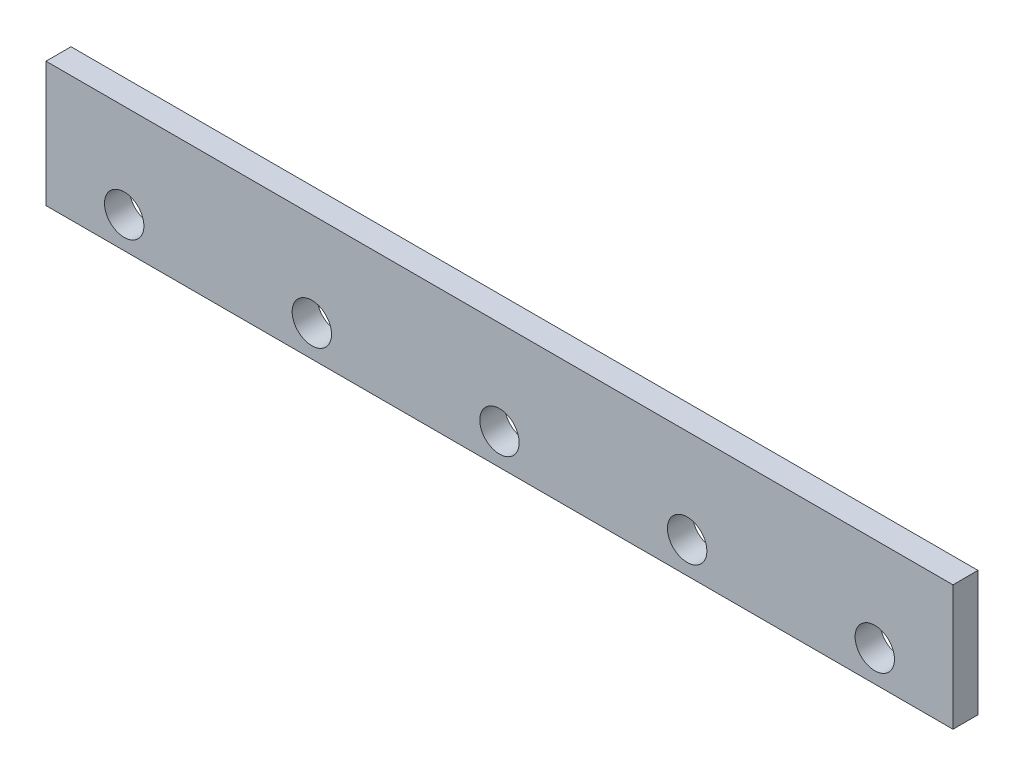
ISO-10303-21;
HEADER;
FILE_DESCRIPTION(('STEP AP214'),'2;1');
FILE_NAME('part.step','',(''),(''),'','','');
FILE_SCHEMA(('AUTOMOTIVE_DESIGN { 1 0 10303 214 1 1 1 1 }'));
ENDSEC;
DATA;
#1=APPLICATION_CONTEXT('core data for automotive mechanical design processes');
#2=APPLICATION_PROTOCOL_DEFINITION('international standard','automotive_design',2000,#1);
#3=PRODUCT_CONTEXT('',#1,'mechanical');
#4=PRODUCT('Part','Part','',(#3));
#5=PRODUCT_RELATED_PRODUCT_CATEGORY('part','',(#4));
#6=PRODUCT_DEFINITION_FORMATION('','',#4);
#7=PRODUCT_DEFINITION_CONTEXT('part definition',#1,'design');
#8=PRODUCT_DEFINITION('design','',#6,#7);
#9=PRODUCT_DEFINITION_SHAPE('','',#8);
#10=(LENGTH_UNIT() NAMED_UNIT(*) SI_UNIT(.MILLI.,.METRE.));
#11=(NAMED_UNIT(*) PLANE_ANGLE_UNIT() SI_UNIT($,.RADIAN.));
#12=(NAMED_UNIT(*) SI_UNIT($,.STERADIAN.) SOLID_ANGLE_UNIT());
#13=UNCERTAINTY_MEASURE_WITH_UNIT(LENGTH_MEASURE(1.E-05),#10,'distance_accuracy_value','');
#14=(GEOMETRIC_REPRESENTATION_CONTEXT(3) GLOBAL_UNCERTAINTY_ASSIGNED_CONTEXT((#13)) GLOBAL_UNIT_ASSIGNED_CONTEXT((#10,
#11,#12)) REPRESENTATION_CONTEXT('',''));
#15=CARTESIAN_POINT('',(0.,0.,0.));
#16=DIRECTION('',(0.,0.,1.));
#17=DIRECTION('',(1.,0.,0.));
#18=AXIS2_PLACEMENT_3D('',#15,#16,#17);
#19=CARTESIAN_POINT('',(0.,0.,16.));
#20=DIRECTION('',(0.,0.,-1.));
#21=DIRECTION('',(-1.,0.,0.));
#22=AXIS2_PLACEMENT_3D('',#19,#20,#21);
#23=PLANE('',#22);
#24=DIRECTION('',(0.,-1.,0.));
#25=VECTOR('',#24,1.);
#26=CARTESIAN_POINT('',(0.,0.,16.));
#27=LINE('',#26,#25);
#28=CARTESIAN_POINT('',(0.,80.,16.));
#29=VERTEX_POINT('',#28);
#30=CARTESIAN_POINT('',(0.,0.,16.));
#31=VERTEX_POINT('',#30);
#32=EDGE_CURVE('E85',#29,#31,#27,.T.);
#33=ORIENTED_EDGE('',*,*,#32,.T.);
#34=DIRECTION('',(1.,0.,0.));
#35=VECTOR('',#34,1.);
#36=CARTESIAN_POINT('',(0.,0.,16.));
#37=LINE('',#36,#35);
#38=CARTESIAN_POINT('',(580.,0.,16.));
#39=VERTEX_POINT('',#38);
#40=EDGE_CURVE('E80',#31,#39,#37,.T.);
#41=ORIENTED_EDGE('',*,*,#40,.T.);
#42=DIRECTION('',(0.,1.,0.));
#43=VECTOR('',#42,1.);
#44=CARTESIAN_POINT('',(580.,0.,16.));
#45=LINE('',#44,#43);
#46=CARTESIAN_POINT('',(580.,80.,16.));
#47=VERTEX_POINT('',#46);
#48=EDGE_CURVE('E83',#39,#47,#45,.T.);
#49=ORIENTED_EDGE('',*,*,#48,.T.);
#50=DIRECTION('',(-1.,0.,0.));
#51=VECTOR('',#50,1.);
#52=CARTESIAN_POINT('',(0.,80.,16.));
#53=LINE('',#52,#51);
#54=EDGE_CURVE('E50',#47,#29,#53,.T.);
#55=ORIENTED_EDGE('',*,*,#54,.T.);
#56=EDGE_LOOP('',(#33,#41,#49,#55));
#57=FACE_BOUND('',#56,.T.);
#58=CARTESIAN_POINT('',(50.,20.,16.));
#59=DIRECTION('',(0.,0.,1.));
#60=DIRECTION('',(1.,0.,0.));
#61=AXIS2_PLACEMENT_3D('',#58,#59,#60);
#62=CIRCLE('',#61,12.6);
#63=CARTESIAN_POINT('',(62.6,20.,16.));
#64=VERTEX_POINT('',#63);
#65=EDGE_CURVE('E100',#64,#64,#62,.T.);
#66=ORIENTED_EDGE('',*,*,#65,.F.);
#67=EDGE_LOOP('',(#66));
#68=FACE_BOUND('',#67,.T.);
#69=CARTESIAN_POINT('',(170.,20.,16.));
#70=DIRECTION('',(0.,0.,1.));
#71=DIRECTION('',(1.,0.,0.));
#72=AXIS2_PLACEMENT_3D('',#69,#70,#71);
#73=CIRCLE('',#72,12.6);
#74=CARTESIAN_POINT('',(182.6,20.,16.));
#75=VERTEX_POINT('',#74);
#76=EDGE_CURVE('E115',#75,#75,#73,.T.);
#77=ORIENTED_EDGE('',*,*,#76,.F.);
#78=EDGE_LOOP('',(#77));
#79=FACE_BOUND('',#78,.T.);
#80=CARTESIAN_POINT('',(290.,20.,16.));
#81=DIRECTION('',(0.,0.,1.));
#82=DIRECTION('',(1.,0.,0.));
#83=AXIS2_PLACEMENT_3D('',#80,#81,#82);
#84=CIRCLE('',#83,12.6);
#85=CARTESIAN_POINT('',(302.6,20.,16.));
#86=VERTEX_POINT('',#85);
#87=EDGE_CURVE('E121',#86,#86,#84,.T.);
#88=ORIENTED_EDGE('',*,*,#87,.F.);
#89=EDGE_LOOP('',(#88));
#90=FACE_BOUND('',#89,.T.);
#91=CARTESIAN_POINT('',(410.,20.,16.));
#92=DIRECTION('',(0.,0.,1.));
#93=DIRECTION('',(1.,0.,0.));
#94=AXIS2_PLACEMENT_3D('',#91,#92,#93);
#95=CIRCLE('',#94,12.6);
#96=CARTESIAN_POINT('',(422.6,20.,16.));
#97=VERTEX_POINT('',#96);
#98=EDGE_CURVE('E127',#97,#97,#95,.T.);
#99=ORIENTED_EDGE('',*,*,#98,.F.);
#100=EDGE_LOOP('',(#99));
#101=FACE_BOUND('',#100,.T.);
#102=CARTESIAN_POINT('',(530.,20.,16.));
#103=DIRECTION('',(0.,0.,1.));
#104=DIRECTION('',(1.,0.,0.));
#105=AXIS2_PLACEMENT_3D('',#102,#103,#104);
#106=CIRCLE('',#105,12.6000000000001);
#107=CARTESIAN_POINT('',(542.6,20.,16.));
#108=VERTEX_POINT('',#107);
#109=EDGE_CURVE('E133',#108,#108,#106,.T.);
#110=ORIENTED_EDGE('',*,*,#109,.F.);
#111=EDGE_LOOP('',(#110));
#112=FACE_BOUND('',#111,.T.);
#113=ADVANCED_FACE('F33',(#57,#68,#79,#90,#101,#112),#23,.F.);
#114=CARTESIAN_POINT('',(0.,0.,0.));
#115=DIRECTION('',(0.,0.,-1.));
#116=DIRECTION('',(-1.,0.,0.));
#117=AXIS2_PLACEMENT_3D('',#114,#115,#116);
#118=PLANE('',#117);
#119=CARTESIAN_POINT('',(410.,20.,0.));
#120=DIRECTION('',(0.,0.,1.));
#121=DIRECTION('',(1.,0.,0.));
#122=AXIS2_PLACEMENT_3D('',#119,#120,#121);
#123=CIRCLE('',#122,12.6);
#124=CARTESIAN_POINT('',(422.6,20.,0.));
#125=VERTEX_POINT('',#124);
#126=EDGE_CURVE('E130',#125,#125,#123,.T.);
#127=ORIENTED_EDGE('',*,*,#126,.T.);
#128=EDGE_LOOP('',(#127));
#129=FACE_BOUND('',#128,.T.);
#130=CARTESIAN_POINT('',(170.,20.,0.));
#131=DIRECTION('',(0.,0.,1.));
#132=DIRECTION('',(1.,0.,0.));
#133=AXIS2_PLACEMENT_3D('',#130,#131,#132);
#134=CIRCLE('',#133,12.6);
#135=CARTESIAN_POINT('',(182.6,20.,0.));
#136=VERTEX_POINT('',#135);
#137=EDGE_CURVE('E118',#136,#136,#134,.T.);
#138=ORIENTED_EDGE('',*,*,#137,.T.);
#139=EDGE_LOOP('',(#138));
#140=FACE_BOUND('',#139,.T.);
#141=DIRECTION('',(0.,-1.,0.));
#142=VECTOR('',#141,1.);
#143=CARTESIAN_POINT('',(0.,0.,0.));
#144=LINE('',#143,#142);
#145=CARTESIAN_POINT('',(0.,80.,0.));
#146=VERTEX_POINT('',#145);
#147=CARTESIAN_POINT('',(0.,0.,0.));
#148=VERTEX_POINT('',#147);
#149=EDGE_CURVE('E97',#146,#148,#144,.T.);
#150=ORIENTED_EDGE('',*,*,#149,.F.);
#151=DIRECTION('',(-1.,0.,0.));
#152=VECTOR('',#151,1.);
#153=CARTESIAN_POINT('',(0.,80.,0.));
#154=LINE('',#153,#152);
#155=CARTESIAN_POINT('',(580.,80.,0.));
#156=VERTEX_POINT('',#155);
#157=EDGE_CURVE('E73',#156,#146,#154,.T.);
#158=ORIENTED_EDGE('',*,*,#157,.F.);
#159=DIRECTION('',(0.,1.,0.));
#160=VECTOR('',#159,1.);
#161=CARTESIAN_POINT('',(580.,0.,0.));
#162=LINE('',#161,#160);
#163=CARTESIAN_POINT('',(580.,0.,0.));
#164=VERTEX_POINT('',#163);
#165=EDGE_CURVE('E67',#164,#156,#162,.T.);
#166=ORIENTED_EDGE('',*,*,#165,.F.);
#167=DIRECTION('',(1.,0.,0.));
#168=VECTOR('',#167,1.);
#169=CARTESIAN_POINT('',(0.,0.,0.));
#170=LINE('',#169,#168);
#171=EDGE_CURVE('E89',#148,#164,#170,.T.);
#172=ORIENTED_EDGE('',*,*,#171,.F.);
#173=EDGE_LOOP('',(#150,#158,#166,#172));
#174=FACE_BOUND('',#173,.T.);
#175=CARTESIAN_POINT('',(50.,20.,0.));
#176=DIRECTION('',(0.,0.,1.));
#177=DIRECTION('',(1.,0.,0.));
#178=AXIS2_PLACEMENT_3D('',#175,#176,#177);
#179=CIRCLE('',#178,12.6);
#180=CARTESIAN_POINT('',(62.6,20.,0.));
#181=VERTEX_POINT('',#180);
#182=EDGE_CURVE('E112',#181,#181,#179,.T.);
#183=ORIENTED_EDGE('',*,*,#182,.T.);
#184=EDGE_LOOP('',(#183));
#185=FACE_BOUND('',#184,.T.);
#186=CARTESIAN_POINT('',(290.,20.,0.));
#187=DIRECTION('',(0.,0.,1.));
#188=DIRECTION('',(1.,0.,0.));
#189=AXIS2_PLACEMENT_3D('',#186,#187,#188);
#190=CIRCLE('',#189,12.6);
#191=CARTESIAN_POINT('',(302.6,20.,0.));
#192=VERTEX_POINT('',#191);
#193=EDGE_CURVE('E124',#192,#192,#190,.T.);
#194=ORIENTED_EDGE('',*,*,#193,.T.);
#195=EDGE_LOOP('',(#194));
#196=FACE_BOUND('',#195,.T.);
#197=CARTESIAN_POINT('',(530.,20.,0.));
#198=DIRECTION('',(0.,0.,1.));
#199=DIRECTION('',(1.,0.,0.));
#200=AXIS2_PLACEMENT_3D('',#197,#198,#199);
#201=CIRCLE('',#200,12.6000000000001);
#202=CARTESIAN_POINT('',(542.6,20.,0.));
#203=VERTEX_POINT('',#202);
#204=EDGE_CURVE('E136',#203,#203,#201,.T.);
#205=ORIENTED_EDGE('',*,*,#204,.T.);
#206=EDGE_LOOP('',(#205));
#207=FACE_BOUND('',#206,.T.);
#208=ADVANCED_FACE('F108',(#129,#140,#174,#185,#196,#207),#118,.T.);
#209=CARTESIAN_POINT('',(0.,0.,16.));
#210=DIRECTION('',(1.,0.,0.));
#211=DIRECTION('',(0.,0.,-1.));
#212=AXIS2_PLACEMENT_3D('',#209,#210,#211);
#213=PLANE('',#212);
#214=ORIENTED_EDGE('',*,*,#149,.T.);
#215=DIRECTION('',(0.,0.,-1.));
#216=VECTOR('',#215,1.);
#217=CARTESIAN_POINT('',(0.,0.,16.));
#218=LINE('',#217,#216);
#219=EDGE_CURVE('E11',#31,#148,#218,.T.);
#220=ORIENTED_EDGE('',*,*,#219,.F.);
#221=ORIENTED_EDGE('',*,*,#32,.F.);
#222=DIRECTION('',(0.,0.,-1.));
#223=VECTOR('',#222,1.);
#224=CARTESIAN_POINT('',(0.,80.,16.));
#225=LINE('',#224,#223);
#226=EDGE_CURVE('E93',#29,#146,#225,.T.);
#227=ORIENTED_EDGE('',*,*,#226,.T.);
#228=EDGE_LOOP('',(#214,#220,#221,#227));
#229=FACE_BOUND('',#228,.T.);
#230=ADVANCED_FACE('F35',(#229),#213,.F.);
#231=CARTESIAN_POINT('',(0.,0.,16.));
#232=DIRECTION('',(0.,1.,0.));
#233=DIRECTION('',(0.,0.,1.));
#234=AXIS2_PLACEMENT_3D('',#231,#232,#233);
#235=PLANE('',#234);
#236=ORIENTED_EDGE('',*,*,#171,.T.);
#237=DIRECTION('',(0.,0.,-1.));
#238=VECTOR('',#237,1.);
#239=CARTESIAN_POINT('',(580.,0.,16.));
#240=LINE('',#239,#238);
#241=EDGE_CURVE('E42',#39,#164,#240,.T.);
#242=ORIENTED_EDGE('',*,*,#241,.F.);
#243=ORIENTED_EDGE('',*,*,#40,.F.);
#244=ORIENTED_EDGE('',*,*,#219,.T.);
#245=EDGE_LOOP('',(#236,#242,#243,#244));
#246=FACE_BOUND('',#245,.T.);
#247=ADVANCED_FACE('F88',(#246),#235,.F.);
#248=CARTESIAN_POINT('',(580.,0.,16.));
#249=DIRECTION('',(-1.,0.,0.));
#250=DIRECTION('',(0.,0.,1.));
#251=AXIS2_PLACEMENT_3D('',#248,#249,#250);
#252=PLANE('',#251);
#253=ORIENTED_EDGE('',*,*,#165,.T.);
#254=DIRECTION('',(0.,0.,-1.));
#255=VECTOR('',#254,1.);
#256=CARTESIAN_POINT('',(580.,80.,16.));
#257=LINE('',#256,#255);
#258=EDGE_CURVE('E90',#47,#156,#257,.T.);
#259=ORIENTED_EDGE('',*,*,#258,.F.);
#260=ORIENTED_EDGE('',*,*,#48,.F.);
#261=ORIENTED_EDGE('',*,*,#241,.T.);
#262=EDGE_LOOP('',(#253,#259,#260,#261));
#263=FACE_BOUND('',#262,.T.);
#264=ADVANCED_FACE('F91',(#263),#252,.F.);
#265=CARTESIAN_POINT('',(0.,80.,16.));
#266=DIRECTION('',(0.,-1.,0.));
#267=DIRECTION('',(0.,0.,-1.));
#268=AXIS2_PLACEMENT_3D('',#265,#266,#267);
#269=PLANE('',#268);
#270=ORIENTED_EDGE('',*,*,#157,.T.);
#271=ORIENTED_EDGE('',*,*,#226,.F.);
#272=ORIENTED_EDGE('',*,*,#54,.F.);
#273=ORIENTED_EDGE('',*,*,#258,.T.);
#274=EDGE_LOOP('',(#270,#271,#272,#273));
#275=FACE_BOUND('',#274,.T.);
#276=ADVANCED_FACE('F105',(#275),#269,.F.);
#277=CARTESIAN_POINT('',(50.,20.,16.));
#278=DIRECTION('',(0.,0.,-1.));
#279=DIRECTION('',(-1.,0.,0.));
#280=AXIS2_PLACEMENT_3D('',#277,#278,#279);
#281=CYLINDRICAL_SURFACE('',#280,12.6);
#282=ORIENTED_EDGE('',*,*,#65,.T.);
#283=EDGE_LOOP('',(#282));
#284=FACE_BOUND('',#283,.T.);
#285=ORIENTED_EDGE('',*,*,#182,.F.);
#286=EDGE_LOOP('',(#285));
#287=FACE_BOUND('',#286,.T.);
#288=ADVANCED_FACE('F153',(#284,#287),#281,.F.);
#289=CARTESIAN_POINT('',(170.,20.,16.));
#290=DIRECTION('',(0.,0.,-1.));
#291=DIRECTION('',(-1.,0.,0.));
#292=AXIS2_PLACEMENT_3D('',#289,#290,#291);
#293=CYLINDRICAL_SURFACE('',#292,12.6);
#294=ORIENTED_EDGE('',*,*,#76,.T.);
#295=EDGE_LOOP('',(#294));
#296=FACE_BOUND('',#295,.T.);
#297=ORIENTED_EDGE('',*,*,#137,.F.);
#298=EDGE_LOOP('',(#297));
#299=FACE_BOUND('',#298,.T.);
#300=ADVANCED_FACE('F199',(#296,#299),#293,.F.);
#301=CARTESIAN_POINT('',(290.,20.,16.));
#302=DIRECTION('',(0.,0.,-1.));
#303=DIRECTION('',(-1.,0.,0.));
#304=AXIS2_PLACEMENT_3D('',#301,#302,#303);
#305=CYLINDRICAL_SURFACE('',#304,12.6);
#306=ORIENTED_EDGE('',*,*,#87,.T.);
#307=EDGE_LOOP('',(#306));
#308=FACE_BOUND('',#307,.T.);
#309=ORIENTED_EDGE('',*,*,#193,.F.);
#310=EDGE_LOOP('',(#309));
#311=FACE_BOUND('',#310,.T.);
#312=ADVANCED_FACE('F207',(#308,#311),#305,.F.);
#313=CARTESIAN_POINT('',(410.,20.,16.));
#314=DIRECTION('',(0.,0.,-1.));
#315=DIRECTION('',(-1.,0.,0.));
#316=AXIS2_PLACEMENT_3D('',#313,#314,#315);
#317=CYLINDRICAL_SURFACE('',#316,12.6);
#318=ORIENTED_EDGE('',*,*,#98,.T.);
#319=EDGE_LOOP('',(#318));
#320=FACE_BOUND('',#319,.T.);
#321=ORIENTED_EDGE('',*,*,#126,.F.);
#322=EDGE_LOOP('',(#321));
#323=FACE_BOUND('',#322,.T.);
#324=ADVANCED_FACE('F215',(#320,#323),#317,.F.);
#325=CARTESIAN_POINT('',(530.,20.,16.));
#326=DIRECTION('',(0.,0.,-1.));
#327=DIRECTION('',(-1.,0.,0.));
#328=AXIS2_PLACEMENT_3D('',#325,#326,#327);
#329=CYLINDRICAL_SURFACE('',#328,12.6000000000001);
#330=ORIENTED_EDGE('',*,*,#109,.T.);
#331=EDGE_LOOP('',(#330));
#332=FACE_BOUND('',#331,.T.);
#333=ORIENTED_EDGE('',*,*,#204,.F.);
#334=EDGE_LOOP('',(#333));
#335=FACE_BOUND('',#334,.T.);
#336=ADVANCED_FACE('F142',(#332,#335),#329,.F.);
#337=CLOSED_SHELL('',(#113,#208,#230,#247,#264,#276,#288,#300,#312,#324,#336));
#338=MANIFOLD_SOLID_BREP('B2',#337);
#339=ADVANCED_BREP_SHAPE_REPRESENTATION('',(#18,#338),#14);
#340=SHAPE_DEFINITION_REPRESENTATION(#9,#339);
ENDSEC;
END-ISO-10303-21;
